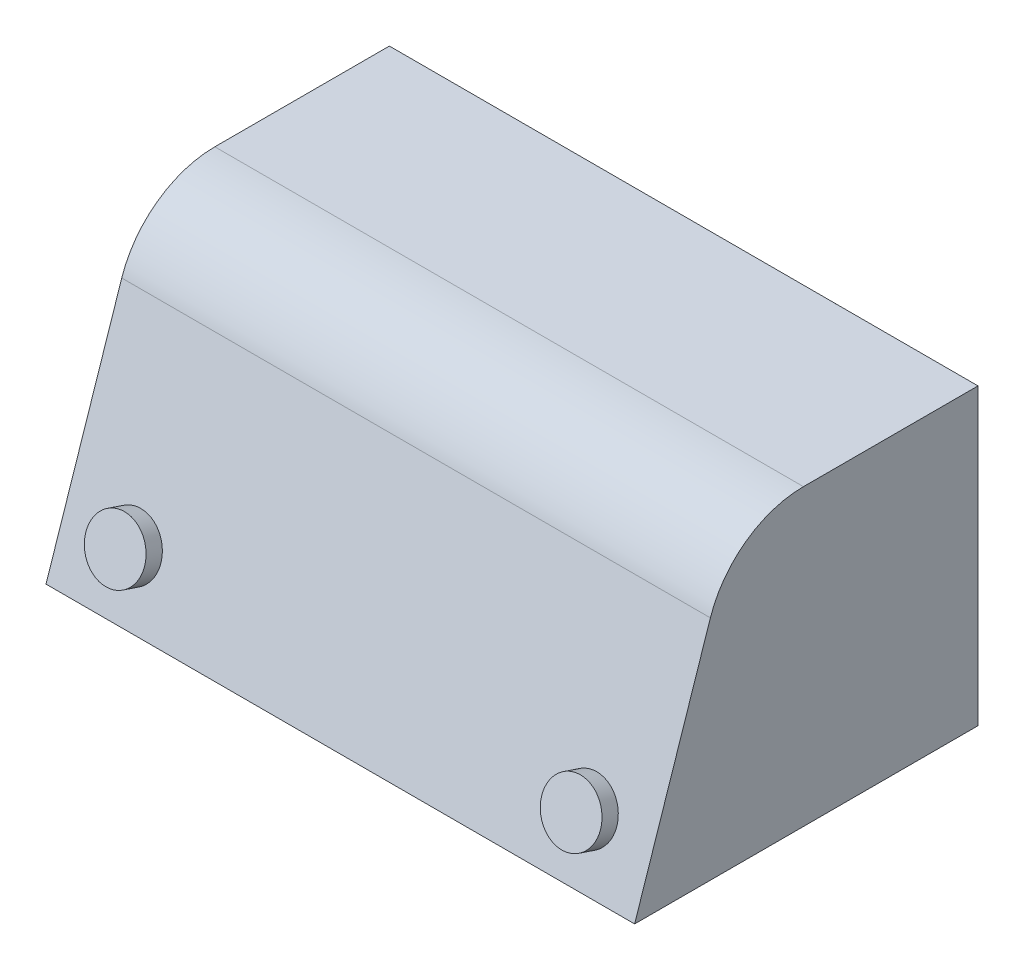
ISO-10303-21;
HEADER;
FILE_DESCRIPTION(('STEP AP214'),'2;1');
FILE_NAME('part.step','',(''),(''),'','','');
FILE_SCHEMA(('AUTOMOTIVE_DESIGN { 1 0 10303 214 1 1 1 1 }'));
ENDSEC;
DATA;
#1=APPLICATION_CONTEXT('core data for automotive mechanical design processes');
#2=APPLICATION_PROTOCOL_DEFINITION('international standard','automotive_design',2000,#1);
#3=PRODUCT_CONTEXT('',#1,'mechanical');
#4=PRODUCT('Part','Part','',(#3));
#5=PRODUCT_RELATED_PRODUCT_CATEGORY('part','',(#4));
#6=PRODUCT_DEFINITION_FORMATION('','',#4);
#7=PRODUCT_DEFINITION_CONTEXT('part definition',#1,'design');
#8=PRODUCT_DEFINITION('design','',#6,#7);
#9=PRODUCT_DEFINITION_SHAPE('','',#8);
#10=(LENGTH_UNIT() NAMED_UNIT(*) SI_UNIT(.MILLI.,.METRE.));
#11=(NAMED_UNIT(*) PLANE_ANGLE_UNIT() SI_UNIT($,.RADIAN.));
#12=(NAMED_UNIT(*) SI_UNIT($,.STERADIAN.) SOLID_ANGLE_UNIT());
#13=UNCERTAINTY_MEASURE_WITH_UNIT(LENGTH_MEASURE(1.E-05),#10,'distance_accuracy_value','');
#14=(GEOMETRIC_REPRESENTATION_CONTEXT(3) GLOBAL_UNCERTAINTY_ASSIGNED_CONTEXT((#13)) GLOBAL_UNIT_ASSIGNED_CONTEXT((#10,
#11,#12)) REPRESENTATION_CONTEXT('',''));
#15=CARTESIAN_POINT('',(0.,0.,0.));
#16=DIRECTION('',(0.,0.,1.));
#17=DIRECTION('',(1.,0.,0.));
#18=AXIS2_PLACEMENT_3D('',#15,#16,#17);
#19=CARTESIAN_POINT('',(120.,40.,35.5848155988775));
#20=DIRECTION('',(1.,0.,0.));
#21=DIRECTION('',(0.,0.,-1.));
#22=AXIS2_PLACEMENT_3D('',#19,#20,#21);
#23=CYLINDRICAL_SURFACE('',#22,20.);
#24=DIRECTION('',(1.,0.,0.));
#25=VECTOR('',#24,1.);
#26=CARTESIAN_POINT('',(120.,60.,35.5848155988775));
#27=LINE('',#26,#25);
#28=CARTESIAN_POINT('',(0.,60.,35.5848155988775));
#29=VERTEX_POINT('',#28);
#30=CARTESIAN_POINT('',(120.,60.,35.5848155988775));
#31=VERTEX_POINT('',#30);
#32=EDGE_CURVE('E99',#29,#31,#27,.T.);
#33=ORIENTED_EDGE('',*,*,#32,.F.);
#34=CARTESIAN_POINT('',(0.,40.,35.5848155988775));
#35=DIRECTION('',(1.,0.,0.));
#36=DIRECTION('',(0.,0.,-1.));
#37=AXIS2_PLACEMENT_3D('',#34,#35,#36);
#38=CIRCLE('',#37,20.);
#39=CARTESIAN_POINT('',(0.,46.3245553203368,54.5584815598877));
#40=VERTEX_POINT('',#39);
#41=EDGE_CURVE('E54',#40,#29,#38,.F.);
#42=ORIENTED_EDGE('',*,*,#41,.F.);
#43=DIRECTION('',(1.,0.,0.));
#44=VECTOR('',#43,1.);
#45=CARTESIAN_POINT('',(120.,46.3245553203367,54.5584815598878));
#46=LINE('',#45,#44);
#47=CARTESIAN_POINT('',(120.,46.3245553203368,54.5584815598877));
#48=VERTEX_POINT('',#47);
#49=EDGE_CURVE('E102',#48,#40,#46,.F.);
#50=ORIENTED_EDGE('',*,*,#49,.F.);
#51=CARTESIAN_POINT('',(120.,40.,35.5848155988775));
#52=DIRECTION('',(1.,0.,0.));
#53=DIRECTION('',(0.,0.,-1.));
#54=AXIS2_PLACEMENT_3D('',#51,#52,#53);
#55=CIRCLE('',#54,20.);
#56=EDGE_CURVE('E47',#31,#48,#55,.T.);
#57=ORIENTED_EDGE('',*,*,#56,.F.);
#58=EDGE_LOOP('',(#33,#42,#50,#57));
#59=FACE_BOUND('',#58,.T.);
#60=ADVANCED_FACE('F33',(#59),#23,.T.);
#61=CARTESIAN_POINT('',(120.,60.,50.));
#62=DIRECTION('',(0.,-0.316227766016838,-0.948683298050514));
#63=DIRECTION('',(0.,0.948683298050514,-0.316227766016838));
#64=AXIS2_PLACEMENT_3D('',#61,#62,#63);
#65=PLANE('',#64);
#66=CARTESIAN_POINT('',(106.51918308492,11.5740347371228,66.1419884209591));
#67=DIRECTION('',(0.,-0.316227766016838,-0.948683298050514));
#68=DIRECTION('',(0.,0.948683298050514,-0.316227766016838));
#69=AXIS2_PLACEMENT_3D('',#66,#67,#68);
#70=CIRCLE('',#69,6.);
#71=CARTESIAN_POINT('',(106.51918308492,17.2661345254259,64.244621824858));
#72=VERTEX_POINT('',#71);
#73=EDGE_CURVE('E11',#72,#72,#70,.F.);
#74=ORIENTED_EDGE('',*,*,#73,.F.);
#75=EDGE_LOOP('',(#74));
#76=FACE_BOUND('',#75,.T.);
#77=CARTESIAN_POINT('',(13.5700972290493,11.5740347371228,66.1419884209591));
#78=DIRECTION('',(0.,-0.316227766016838,-0.948683298050514));
#79=DIRECTION('',(0.,0.948683298050514,-0.316227766016838));
#80=AXIS2_PLACEMENT_3D('',#77,#78,#79);
#81=CIRCLE('',#80,6.);
#82=CARTESIAN_POINT('',(13.5700972290493,17.2661345254259,64.244621824858));
#83=VERTEX_POINT('',#82);
#84=EDGE_CURVE('E40',#83,#83,#81,.F.);
#85=ORIENTED_EDGE('',*,*,#84,.F.);
#86=EDGE_LOOP('',(#85));
#87=FACE_BOUND('',#86,.T.);
#88=DIRECTION('',(0.,-0.948683298050514,0.316227766016838));
#89=VECTOR('',#88,1.);
#90=CARTESIAN_POINT('',(120.,60.,50.));
#91=LINE('',#90,#89);
#92=CARTESIAN_POINT('',(120.,0.,70.));
#93=VERTEX_POINT('',#92);
#94=EDGE_CURVE('E77',#48,#93,#91,.T.);
#95=ORIENTED_EDGE('',*,*,#94,.F.);
#96=ORIENTED_EDGE('',*,*,#49,.T.);
#97=DIRECTION('',(0.,-0.948683298050514,0.316227766016838));
#98=VECTOR('',#97,1.);
#99=CARTESIAN_POINT('',(0.,60.,50.));
#100=LINE('',#99,#98);
#101=CARTESIAN_POINT('',(0.,0.,70.));
#102=VERTEX_POINT('',#101);
#103=EDGE_CURVE('E97',#40,#102,#100,.T.);
#104=ORIENTED_EDGE('',*,*,#103,.T.);
#105=DIRECTION('',(-1.,0.,0.));
#106=VECTOR('',#105,1.);
#107=CARTESIAN_POINT('',(120.,0.,70.));
#108=LINE('',#107,#106);
#109=EDGE_CURVE('E89',#93,#102,#108,.T.);
#110=ORIENTED_EDGE('',*,*,#109,.F.);
#111=EDGE_LOOP('',(#95,#96,#104,#110));
#112=FACE_BOUND('',#111,.T.);
#113=ADVANCED_FACE('F95',(#76,#87,#112),#65,.F.);
#114=CARTESIAN_POINT('',(120.,0.,70.));
#115=DIRECTION('',(0.,1.,0.));
#116=DIRECTION('',(0.,0.,1.));
#117=AXIS2_PLACEMENT_3D('',#114,#115,#116);
#118=PLANE('',#117);
#119=DIRECTION('',(0.,0.,-1.));
#120=VECTOR('',#119,1.);
#121=CARTESIAN_POINT('',(0.,0.,70.));
#122=LINE('',#121,#120);
#123=CARTESIAN_POINT('',(0.,0.,0.));
#124=VERTEX_POINT('',#123);
#125=EDGE_CURVE('E166',#102,#124,#122,.T.);
#126=ORIENTED_EDGE('',*,*,#125,.T.);
#127=DIRECTION('',(-1.,0.,0.));
#128=VECTOR('',#127,1.);
#129=CARTESIAN_POINT('',(120.,0.,0.));
#130=LINE('',#129,#128);
#131=CARTESIAN_POINT('',(120.,0.,0.));
#132=VERTEX_POINT('',#131);
#133=EDGE_CURVE('E91',#132,#124,#130,.T.);
#134=ORIENTED_EDGE('',*,*,#133,.F.);
#135=DIRECTION('',(0.,0.,-1.));
#136=VECTOR('',#135,1.);
#137=CARTESIAN_POINT('',(120.,0.,70.));
#138=LINE('',#137,#136);
#139=EDGE_CURVE('E80',#93,#132,#138,.T.);
#140=ORIENTED_EDGE('',*,*,#139,.F.);
#141=ORIENTED_EDGE('',*,*,#109,.T.);
#142=EDGE_LOOP('',(#126,#134,#140,#141));
#143=FACE_BOUND('',#142,.T.);
#144=ADVANCED_FACE('F88',(#143),#118,.F.);
#145=CARTESIAN_POINT('',(120.,0.,0.));
#146=DIRECTION('',(0.,0.,1.));
#147=DIRECTION('',(1.,0.,0.));
#148=AXIS2_PLACEMENT_3D('',#145,#146,#147);
#149=PLANE('',#148);
#150=DIRECTION('',(0.,1.,0.));
#151=VECTOR('',#150,1.);
#152=CARTESIAN_POINT('',(0.,0.,0.));
#153=LINE('',#152,#151);
#154=CARTESIAN_POINT('',(0.,60.,0.));
#155=VERTEX_POINT('',#154);
#156=EDGE_CURVE('E168',#124,#155,#153,.T.);
#157=ORIENTED_EDGE('',*,*,#156,.T.);
#158=DIRECTION('',(-1.,0.,0.));
#159=VECTOR('',#158,1.);
#160=CARTESIAN_POINT('',(120.,60.,0.));
#161=LINE('',#160,#159);
#162=CARTESIAN_POINT('',(120.,60.,0.));
#163=VERTEX_POINT('',#162);
#164=EDGE_CURVE('E104',#163,#155,#161,.T.);
#165=ORIENTED_EDGE('',*,*,#164,.F.);
#166=DIRECTION('',(0.,1.,0.));
#167=VECTOR('',#166,1.);
#168=CARTESIAN_POINT('',(120.,0.,0.));
#169=LINE('',#168,#167);
#170=EDGE_CURVE('E93',#132,#163,#169,.T.);
#171=ORIENTED_EDGE('',*,*,#170,.F.);
#172=ORIENTED_EDGE('',*,*,#133,.T.);
#173=EDGE_LOOP('',(#157,#165,#171,#172));
#174=FACE_BOUND('',#173,.T.);
#175=ADVANCED_FACE('F121',(#174),#149,.F.);
#176=CARTESIAN_POINT('',(120.,60.,0.));
#177=DIRECTION('',(0.,-1.,0.));
#178=DIRECTION('',(0.,0.,-1.));
#179=AXIS2_PLACEMENT_3D('',#176,#177,#178);
#180=PLANE('',#179);
#181=DIRECTION('',(0.,0.,1.));
#182=VECTOR('',#181,1.);
#183=CARTESIAN_POINT('',(0.,60.,0.));
#184=LINE('',#183,#182);
#185=EDGE_CURVE('E84',#155,#29,#184,.T.);
#186=ORIENTED_EDGE('',*,*,#185,.T.);
#187=ORIENTED_EDGE('',*,*,#32,.T.);
#188=DIRECTION('',(0.,0.,1.));
#189=VECTOR('',#188,1.);
#190=CARTESIAN_POINT('',(120.,60.,0.));
#191=LINE('',#190,#189);
#192=EDGE_CURVE('E163',#163,#31,#191,.T.);
#193=ORIENTED_EDGE('',*,*,#192,.F.);
#194=ORIENTED_EDGE('',*,*,#164,.T.);
#195=EDGE_LOOP('',(#186,#187,#193,#194));
#196=FACE_BOUND('',#195,.T.);
#197=ADVANCED_FACE('F127',(#196),#180,.F.);
#198=CARTESIAN_POINT('',(120.,0.,0.));
#199=DIRECTION('',(1.,0.,0.));
#200=DIRECTION('',(0.,0.,-1.));
#201=AXIS2_PLACEMENT_3D('',#198,#199,#200);
#202=PLANE('',#201);
#203=ORIENTED_EDGE('',*,*,#192,.T.);
#204=ORIENTED_EDGE('',*,*,#56,.T.);
#205=ORIENTED_EDGE('',*,*,#94,.T.);
#206=ORIENTED_EDGE('',*,*,#139,.T.);
#207=ORIENTED_EDGE('',*,*,#170,.T.);
#208=EDGE_LOOP('',(#203,#204,#205,#206,#207));
#209=FACE_BOUND('',#208,.T.);
#210=ADVANCED_FACE('F79',(#209),#202,.T.);
#211=CARTESIAN_POINT('',(0.,0.,0.));
#212=DIRECTION('',(1.,0.,0.));
#213=DIRECTION('',(0.,0.,-1.));
#214=AXIS2_PLACEMENT_3D('',#211,#212,#213);
#215=PLANE('',#214);
#216=ORIENTED_EDGE('',*,*,#103,.F.);
#217=ORIENTED_EDGE('',*,*,#41,.T.);
#218=ORIENTED_EDGE('',*,*,#185,.F.);
#219=ORIENTED_EDGE('',*,*,#156,.F.);
#220=ORIENTED_EDGE('',*,*,#125,.F.);
#221=EDGE_LOOP('',(#216,#217,#218,#219,#220));
#222=FACE_BOUND('',#221,.T.);
#223=ADVANCED_FACE('F132',(#222),#215,.F.);
#224=CARTESIAN_POINT('',(13.5700972290493,12.6808319181818,69.4623799641359));
#225=DIRECTION('',(0.,-0.316227766016838,-0.948683298050514));
#226=DIRECTION('',(0.,0.948683298050514,-0.316227766016838));
#227=AXIS2_PLACEMENT_3D('',#224,#225,#226);
#228=CYLINDRICAL_SURFACE('',#227,6.);
#229=CARTESIAN_POINT('',(13.5700972290493,12.6808319181818,69.4623799641359));
#230=DIRECTION('',(0.,0.316227766016838,0.948683298050514));
#231=DIRECTION('',(0.,-0.948683298050514,0.316227766016838));
#232=AXIS2_PLACEMENT_3D('',#229,#230,#231);
#233=CIRCLE('',#232,6.);
#234=CARTESIAN_POINT('',(13.5700972290493,6.98873212987868,71.3597465602369));
#235=VERTEX_POINT('',#234);
#236=EDGE_CURVE('E157',#235,#235,#233,.T.);
#237=ORIENTED_EDGE('',*,*,#236,.F.);
#238=EDGE_LOOP('',(#237));
#239=FACE_BOUND('',#238,.T.);
#240=ORIENTED_EDGE('',*,*,#84,.T.);
#241=EDGE_LOOP('',(#240));
#242=FACE_BOUND('',#241,.T.);
#243=ADVANCED_FACE('F113',(#239,#242),#228,.T.);
#244=CARTESIAN_POINT('',(13.5700972290493,12.6808319181818,69.4623799641359));
#245=DIRECTION('',(0.,0.316227766016838,0.948683298050514));
#246=DIRECTION('',(0.,-0.948683298050514,0.316227766016838));
#247=AXIS2_PLACEMENT_3D('',#244,#245,#246);
#248=PLANE('',#247);
#249=ORIENTED_EDGE('',*,*,#236,.T.);
#250=EDGE_LOOP('',(#249));
#251=FACE_BOUND('',#250,.T.);
#252=ADVANCED_FACE('F140',(#251),#248,.T.);
#253=CARTESIAN_POINT('',(106.51918308492,12.6808319181818,69.4623799641359));
#254=DIRECTION('',(0.,-0.316227766016838,-0.948683298050514));
#255=DIRECTION('',(0.,0.948683298050514,-0.316227766016838));
#256=AXIS2_PLACEMENT_3D('',#253,#254,#255);
#257=CYLINDRICAL_SURFACE('',#256,6.);
#258=CARTESIAN_POINT('',(106.51918308492,12.6808319181818,69.4623799641359));
#259=DIRECTION('',(0.,0.316227766016838,0.948683298050514));
#260=DIRECTION('',(0.,-0.948683298050514,0.316227766016838));
#261=AXIS2_PLACEMENT_3D('',#258,#259,#260);
#262=CIRCLE('',#261,6.);
#263=CARTESIAN_POINT('',(106.51918308492,6.98873212987868,71.3597465602369));
#264=VERTEX_POINT('',#263);
#265=EDGE_CURVE('E156',#264,#264,#262,.T.);
#266=ORIENTED_EDGE('',*,*,#265,.F.);
#267=EDGE_LOOP('',(#266));
#268=FACE_BOUND('',#267,.T.);
#269=ORIENTED_EDGE('',*,*,#73,.T.);
#270=EDGE_LOOP('',(#269));
#271=FACE_BOUND('',#270,.T.);
#272=ADVANCED_FACE('F144',(#268,#271),#257,.T.);
#273=CARTESIAN_POINT('',(106.51918308492,12.6808319181818,69.4623799641359));
#274=DIRECTION('',(0.,0.316227766016838,0.948683298050514));
#275=DIRECTION('',(0.,-0.948683298050514,0.316227766016838));
#276=AXIS2_PLACEMENT_3D('',#273,#274,#275);
#277=PLANE('',#276);
#278=ORIENTED_EDGE('',*,*,#265,.T.);
#279=EDGE_LOOP('',(#278));
#280=FACE_BOUND('',#279,.T.);
#281=ADVANCED_FACE('F148',(#280),#277,.T.);
#282=CLOSED_SHELL('',(#60,#113,#144,#175,#197,#210,#223,#243,#252,#272,#281));
#283=MANIFOLD_SOLID_BREP('B2',#282);
#284=ADVANCED_BREP_SHAPE_REPRESENTATION('',(#18,#283),#14);
#285=SHAPE_DEFINITION_REPRESENTATION(#9,#284);
ENDSEC;
END-ISO-10303-21;
